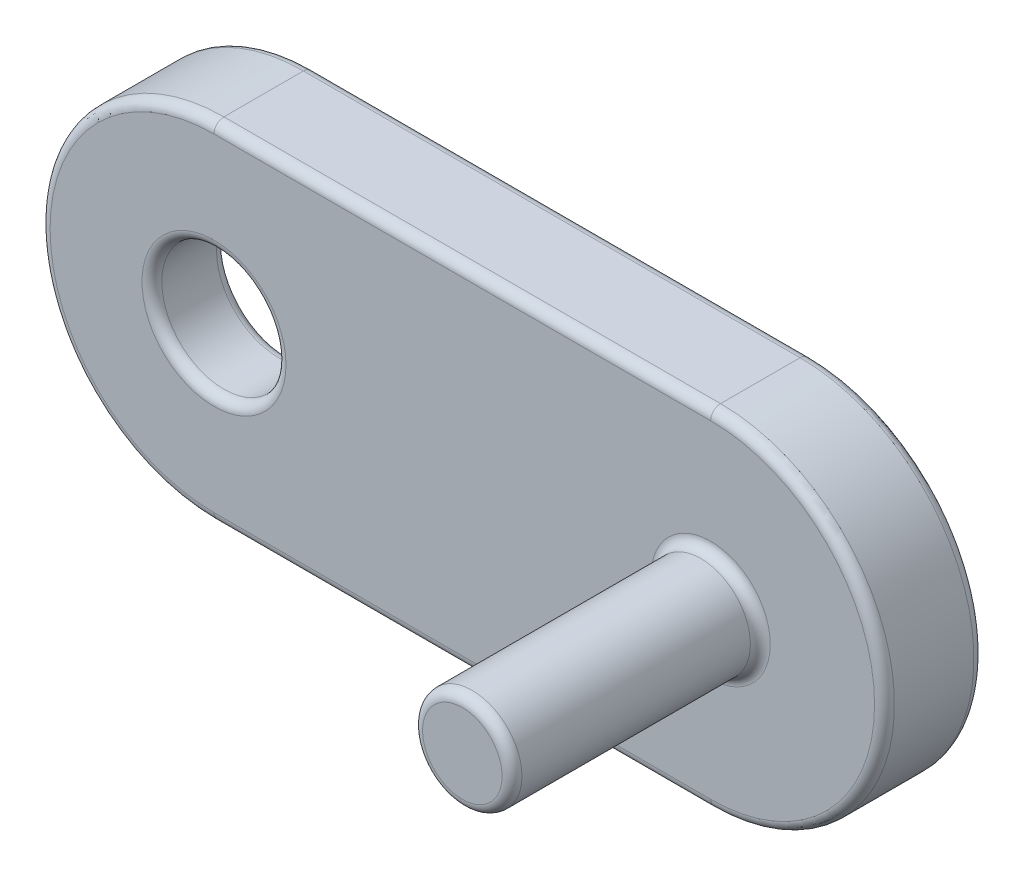
ISO-10303-21;
HEADER;
FILE_DESCRIPTION(('STEP AP214'),'2;1');
FILE_NAME('part.step','',(''),(''),'','','');
FILE_SCHEMA(('AUTOMOTIVE_DESIGN { 1 0 10303 214 1 1 1 1 }'));
ENDSEC;
DATA;
#1=APPLICATION_CONTEXT('core data for automotive mechanical design processes');
#2=APPLICATION_PROTOCOL_DEFINITION('international standard','automotive_design',2000,#1);
#3=PRODUCT_CONTEXT('',#1,'mechanical');
#4=PRODUCT('Part','Part','',(#3));
#5=PRODUCT_RELATED_PRODUCT_CATEGORY('part','',(#4));
#6=PRODUCT_DEFINITION_FORMATION('','',#4);
#7=PRODUCT_DEFINITION_CONTEXT('part definition',#1,'design');
#8=PRODUCT_DEFINITION('design','',#6,#7);
#9=PRODUCT_DEFINITION_SHAPE('','',#8);
#10=(LENGTH_UNIT() NAMED_UNIT(*) SI_UNIT(.MILLI.,.METRE.));
#11=(NAMED_UNIT(*) PLANE_ANGLE_UNIT() SI_UNIT($,.RADIAN.));
#12=(NAMED_UNIT(*) SI_UNIT($,.STERADIAN.) SOLID_ANGLE_UNIT());
#13=UNCERTAINTY_MEASURE_WITH_UNIT(LENGTH_MEASURE(1.E-05),#10,'distance_accuracy_value','');
#14=(GEOMETRIC_REPRESENTATION_CONTEXT(3) GLOBAL_UNCERTAINTY_ASSIGNED_CONTEXT((#13)) GLOBAL_UNIT_ASSIGNED_CONTEXT((#10,
#11,#12)) REPRESENTATION_CONTEXT('',''));
#15=CARTESIAN_POINT('',(0.,0.,0.));
#16=DIRECTION('',(0.,0.,1.));
#17=DIRECTION('',(1.,0.,0.));
#18=AXIS2_PLACEMENT_3D('',#15,#16,#17);
#19=CARTESIAN_POINT('',(-5.,0.,2.));
#20=DIRECTION('',(0.,0.,1.));
#21=DIRECTION('',(1.,0.,0.));
#22=AXIS2_PLACEMENT_3D('',#19,#20,#21);
#23=PLANE('',#22);
#24=CARTESIAN_POINT('',(-5.,0.,2.));
#25=DIRECTION('',(0.,0.,1.));
#26=DIRECTION('',(1.,0.,0.));
#27=AXIS2_PLACEMENT_3D('',#24,#25,#26);
#28=CIRCLE('',#27,1.45);
#29=CARTESIAN_POINT('',(-3.55,0.,2.));
#30=VERTEX_POINT('',#29);
#31=EDGE_CURVE('E245',#30,#30,#28,.F.);
#32=ORIENTED_EDGE('',*,*,#31,.T.);
#33=EDGE_LOOP('',(#32));
#34=FACE_BOUND('',#33,.T.);
#35=CARTESIAN_POINT('',(5.,0.,2.));
#36=DIRECTION('',(0.,0.,1.));
#37=DIRECTION('',(1.,0.,0.));
#38=AXIS2_PLACEMENT_3D('',#35,#36,#37);
#39=CIRCLE('',#38,3.3);
#40=CARTESIAN_POINT('',(5.,-3.3,2.));
#41=VERTEX_POINT('',#40);
#42=CARTESIAN_POINT('',(5.,3.3,2.));
#43=VERTEX_POINT('',#42);
#44=EDGE_CURVE('E48',#41,#43,#39,.T.);
#45=ORIENTED_EDGE('',*,*,#44,.T.);
#46=DIRECTION('',(-1.,0.,0.));
#47=VECTOR('',#46,1.);
#48=CARTESIAN_POINT('',(-5.,3.3,2.));
#49=LINE('',#48,#47);
#50=CARTESIAN_POINT('',(-5.,3.3,2.));
#51=VERTEX_POINT('',#50);
#52=EDGE_CURVE('E243',#43,#51,#49,.T.);
#53=ORIENTED_EDGE('',*,*,#52,.T.);
#54=CARTESIAN_POINT('',(-5.,0.,2.));
#55=DIRECTION('',(0.,0.,1.));
#56=DIRECTION('',(1.,0.,0.));
#57=AXIS2_PLACEMENT_3D('',#54,#55,#56);
#58=CIRCLE('',#57,3.3);
#59=CARTESIAN_POINT('',(-5.,-3.3,2.));
#60=VERTEX_POINT('',#59);
#61=EDGE_CURVE('E239',#51,#60,#58,.T.);
#62=ORIENTED_EDGE('',*,*,#61,.T.);
#63=DIRECTION('',(1.,0.,0.));
#64=VECTOR('',#63,1.);
#65=CARTESIAN_POINT('',(5.,-3.3,2.));
#66=LINE('',#65,#64);
#67=EDGE_CURVE('E53',#60,#41,#66,.T.);
#68=ORIENTED_EDGE('',*,*,#67,.T.);
#69=EDGE_LOOP('',(#45,#53,#62,#68));
#70=FACE_BOUND('',#69,.T.);
#71=CARTESIAN_POINT('',(5.,0.,2.));
#72=DIRECTION('',(0.,0.,1.));
#73=DIRECTION('',(1.,0.,0.));
#74=AXIS2_PLACEMENT_3D('',#71,#72,#73);
#75=CIRCLE('',#74,1.2);
#76=CARTESIAN_POINT('',(6.2,0.,2.));
#77=VERTEX_POINT('',#76);
#78=EDGE_CURVE('E236',#77,#77,#75,.F.);
#79=ORIENTED_EDGE('',*,*,#78,.T.);
#80=EDGE_LOOP('',(#79));
#81=FACE_BOUND('',#80,.T.);
#82=ADVANCED_FACE('F33',(#34,#70,#81),#23,.T.);
#83=CARTESIAN_POINT('',(-5.,0.,2.));
#84=DIRECTION('',(0.,0.,-1.));
#85=DIRECTION('',(-1.,0.,0.));
#86=AXIS2_PLACEMENT_3D('',#83,#84,#85);
#87=CYLINDRICAL_SURFACE('',#86,3.5);
#88=DIRECTION('',(0.,0.,-1.));
#89=VECTOR('',#88,1.);
#90=CARTESIAN_POINT('',(-5.,3.5,2.));
#91=LINE('',#90,#89);
#92=CARTESIAN_POINT('',(-5.,3.5,1.8));
#93=VERTEX_POINT('',#92);
#94=CARTESIAN_POINT('',(-5.,3.5,0.2));
#95=VERTEX_POINT('',#94);
#96=EDGE_CURVE('E334',#93,#95,#91,.T.);
#97=ORIENTED_EDGE('',*,*,#96,.T.);
#98=CARTESIAN_POINT('',(-5.,0.,0.2));
#99=DIRECTION('',(0.,0.,1.));
#100=DIRECTION('',(1.,0.,0.));
#101=AXIS2_PLACEMENT_3D('',#98,#99,#100);
#102=CIRCLE('',#101,3.5);
#103=CARTESIAN_POINT('',(-5.,-3.5,0.2));
#104=VERTEX_POINT('',#103);
#105=EDGE_CURVE('E234',#95,#104,#102,.T.);
#106=ORIENTED_EDGE('',*,*,#105,.T.);
#107=DIRECTION('',(0.,0.,-1.));
#108=VECTOR('',#107,1.);
#109=CARTESIAN_POINT('',(-5.,-3.5,2.));
#110=LINE('',#109,#108);
#111=CARTESIAN_POINT('',(-5.,-3.5,1.8));
#112=VERTEX_POINT('',#111);
#113=EDGE_CURVE('E297',#112,#104,#110,.T.);
#114=ORIENTED_EDGE('',*,*,#113,.F.);
#115=CARTESIAN_POINT('',(-5.,0.,1.8));
#116=DIRECTION('',(0.,0.,1.));
#117=DIRECTION('',(1.,0.,0.));
#118=AXIS2_PLACEMENT_3D('',#115,#116,#117);
#119=CIRCLE('',#118,3.5);
#120=EDGE_CURVE('E232',#112,#93,#119,.F.);
#121=ORIENTED_EDGE('',*,*,#120,.T.);
#122=EDGE_LOOP('',(#97,#106,#114,#121));
#123=FACE_BOUND('',#122,.T.);
#124=ADVANCED_FACE('F35',(#123),#87,.T.);
#125=CARTESIAN_POINT('',(-5.,-3.5,2.));
#126=DIRECTION('',(0.,1.,0.));
#127=DIRECTION('',(0.,0.,1.));
#128=AXIS2_PLACEMENT_3D('',#125,#126,#127);
#129=PLANE('',#128);
#130=ORIENTED_EDGE('',*,*,#113,.T.);
#131=DIRECTION('',(1.,0.,0.));
#132=VECTOR('',#131,1.);
#133=CARTESIAN_POINT('',(-5.,-3.5,0.2));
#134=LINE('',#133,#132);
#135=CARTESIAN_POINT('',(5.,-3.5,0.2));
#136=VERTEX_POINT('',#135);
#137=EDGE_CURVE('E202',#104,#136,#134,.T.);
#138=ORIENTED_EDGE('',*,*,#137,.T.);
#139=DIRECTION('',(0.,0.,-1.));
#140=VECTOR('',#139,1.);
#141=CARTESIAN_POINT('',(5.,-3.5,2.));
#142=LINE('',#141,#140);
#143=CARTESIAN_POINT('',(5.,-3.5,1.8));
#144=VERTEX_POINT('',#143);
#145=EDGE_CURVE('E304',#144,#136,#142,.T.);
#146=ORIENTED_EDGE('',*,*,#145,.F.);
#147=DIRECTION('',(1.,0.,0.));
#148=VECTOR('',#147,1.);
#149=CARTESIAN_POINT('',(-5.,-3.5,1.8));
#150=LINE('',#149,#148);
#151=EDGE_CURVE('E200',#144,#112,#150,.F.);
#152=ORIENTED_EDGE('',*,*,#151,.T.);
#153=EDGE_LOOP('',(#130,#138,#146,#152));
#154=FACE_BOUND('',#153,.T.);
#155=ADVANCED_FACE('F278',(#154),#129,.F.);
#156=CARTESIAN_POINT('',(5.,0.,2.));
#157=DIRECTION('',(0.,0.,-1.));
#158=DIRECTION('',(-1.,0.,0.));
#159=AXIS2_PLACEMENT_3D('',#156,#157,#158);
#160=CYLINDRICAL_SURFACE('',#159,3.5);
#161=ORIENTED_EDGE('',*,*,#145,.T.);
#162=CARTESIAN_POINT('',(5.,0.,0.2));
#163=DIRECTION('',(0.,0.,1.));
#164=DIRECTION('',(1.,0.,0.));
#165=AXIS2_PLACEMENT_3D('',#162,#163,#164);
#166=CIRCLE('',#165,3.5);
#167=CARTESIAN_POINT('',(5.,3.5,0.2));
#168=VERTEX_POINT('',#167);
#169=EDGE_CURVE('E225',#136,#168,#166,.T.);
#170=ORIENTED_EDGE('',*,*,#169,.T.);
#171=DIRECTION('',(0.,0.,-1.));
#172=VECTOR('',#171,1.);
#173=CARTESIAN_POINT('',(5.,3.5,2.));
#174=LINE('',#173,#172);
#175=CARTESIAN_POINT('',(5.,3.5,1.8));
#176=VERTEX_POINT('',#175);
#177=EDGE_CURVE('E329',#176,#168,#174,.T.);
#178=ORIENTED_EDGE('',*,*,#177,.F.);
#179=CARTESIAN_POINT('',(5.,0.,1.8));
#180=DIRECTION('',(0.,0.,1.));
#181=DIRECTION('',(1.,0.,0.));
#182=AXIS2_PLACEMENT_3D('',#179,#180,#181);
#183=CIRCLE('',#182,3.5);
#184=EDGE_CURVE('E223',#176,#144,#183,.F.);
#185=ORIENTED_EDGE('',*,*,#184,.T.);
#186=EDGE_LOOP('',(#161,#170,#178,#185));
#187=FACE_BOUND('',#186,.T.);
#188=ADVANCED_FACE('F287',(#187),#160,.T.);
#189=CARTESIAN_POINT('',(-5.,3.5,2.));
#190=DIRECTION('',(0.,-1.,0.));
#191=DIRECTION('',(0.,0.,-1.));
#192=AXIS2_PLACEMENT_3D('',#189,#190,#191);
#193=PLANE('',#192);
#194=ORIENTED_EDGE('',*,*,#177,.T.);
#195=DIRECTION('',(-1.,0.,0.));
#196=VECTOR('',#195,1.);
#197=CARTESIAN_POINT('',(-5.,3.5,0.2));
#198=LINE('',#197,#196);
#199=EDGE_CURVE('E230',#168,#95,#198,.T.);
#200=ORIENTED_EDGE('',*,*,#199,.T.);
#201=ORIENTED_EDGE('',*,*,#96,.F.);
#202=DIRECTION('',(-1.,0.,0.));
#203=VECTOR('',#202,1.);
#204=CARTESIAN_POINT('',(5.,3.5,1.8));
#205=LINE('',#204,#203);
#206=EDGE_CURVE('E227',#93,#176,#205,.F.);
#207=ORIENTED_EDGE('',*,*,#206,.T.);
#208=EDGE_LOOP('',(#194,#200,#201,#207));
#209=FACE_BOUND('',#208,.T.);
#210=ADVANCED_FACE('F284',(#209),#193,.F.);
#211=CARTESIAN_POINT('',(-5.,0.,0.));
#212=DIRECTION('',(0.,0.,1.));
#213=DIRECTION('',(1.,0.,0.));
#214=AXIS2_PLACEMENT_3D('',#211,#212,#213);
#215=PLANE('',#214);
#216=CARTESIAN_POINT('',(5.,0.,0.));
#217=DIRECTION('',(0.,0.,1.));
#218=DIRECTION('',(1.,0.,0.));
#219=AXIS2_PLACEMENT_3D('',#216,#217,#218);
#220=CIRCLE('',#219,3.3);
#221=CARTESIAN_POINT('',(5.,3.3,0.));
#222=VERTEX_POINT('',#221);
#223=CARTESIAN_POINT('',(5.,-3.3,0.));
#224=VERTEX_POINT('',#223);
#225=EDGE_CURVE('E218',#222,#224,#220,.F.);
#226=ORIENTED_EDGE('',*,*,#225,.T.);
#227=DIRECTION('',(1.,0.,0.));
#228=VECTOR('',#227,1.);
#229=CARTESIAN_POINT('',(-5.,-3.3,0.));
#230=LINE('',#229,#228);
#231=CARTESIAN_POINT('',(-5.,-3.3,0.));
#232=VERTEX_POINT('',#231);
#233=EDGE_CURVE('E220',#224,#232,#230,.F.);
#234=ORIENTED_EDGE('',*,*,#233,.T.);
#235=CARTESIAN_POINT('',(-5.,0.,0.));
#236=DIRECTION('',(0.,0.,1.));
#237=DIRECTION('',(1.,0.,0.));
#238=AXIS2_PLACEMENT_3D('',#235,#236,#237);
#239=CIRCLE('',#238,3.3);
#240=CARTESIAN_POINT('',(-5.,3.3,0.));
#241=VERTEX_POINT('',#240);
#242=EDGE_CURVE('E214',#232,#241,#239,.F.);
#243=ORIENTED_EDGE('',*,*,#242,.T.);
#244=DIRECTION('',(-1.,0.,0.));
#245=VECTOR('',#244,1.);
#246=CARTESIAN_POINT('',(-5.,3.3,0.));
#247=LINE('',#246,#245);
#248=EDGE_CURVE('E216',#241,#222,#247,.F.);
#249=ORIENTED_EDGE('',*,*,#248,.T.);
#250=EDGE_LOOP('',(#226,#234,#243,#249));
#251=FACE_BOUND('',#250,.T.);
#252=DIRECTION('',(-1.,0.,0.));
#253=VECTOR('',#252,1.);
#254=CARTESIAN_POINT('',(-5.,-3.2,0.));
#255=LINE('',#254,#253);
#256=CARTESIAN_POINT('',(-5.,-3.2,0.));
#257=VERTEX_POINT('',#256);
#258=CARTESIAN_POINT('',(5.,-3.2,0.));
#259=VERTEX_POINT('',#258);
#260=EDGE_CURVE('E209',#257,#259,#255,.F.);
#261=ORIENTED_EDGE('',*,*,#260,.T.);
#262=CARTESIAN_POINT('',(5.,0.,0.));
#263=DIRECTION('',(0.,0.,1.));
#264=DIRECTION('',(1.,0.,0.));
#265=AXIS2_PLACEMENT_3D('',#262,#263,#264);
#266=CIRCLE('',#265,3.2);
#267=CARTESIAN_POINT('',(5.,3.2,0.));
#268=VERTEX_POINT('',#267);
#269=EDGE_CURVE('E211',#259,#268,#266,.T.);
#270=ORIENTED_EDGE('',*,*,#269,.T.);
#271=DIRECTION('',(1.,0.,0.));
#272=VECTOR('',#271,1.);
#273=CARTESIAN_POINT('',(-5.,3.2,0.));
#274=LINE('',#273,#272);
#275=CARTESIAN_POINT('',(-5.,3.2,0.));
#276=VERTEX_POINT('',#275);
#277=EDGE_CURVE('E205',#268,#276,#274,.F.);
#278=ORIENTED_EDGE('',*,*,#277,.T.);
#279=CARTESIAN_POINT('',(-5.,0.,0.));
#280=DIRECTION('',(0.,0.,1.));
#281=DIRECTION('',(1.,0.,0.));
#282=AXIS2_PLACEMENT_3D('',#279,#280,#281);
#283=CIRCLE('',#282,3.2);
#284=EDGE_CURVE('E207',#276,#257,#283,.T.);
#285=ORIENTED_EDGE('',*,*,#284,.T.);
#286=EDGE_LOOP('',(#261,#270,#278,#285));
#287=FACE_BOUND('',#286,.T.);
#288=ADVANCED_FACE('F282',(#251,#287),#215,.F.);
#289=CARTESIAN_POINT('',(-5.,0.,0.5));
#290=DIRECTION('',(0.,0.,-1.));
#291=DIRECTION('',(-1.,0.,0.));
#292=AXIS2_PLACEMENT_3D('',#289,#290,#291);
#293=CYLINDRICAL_SURFACE('',#292,3.);
#294=DIRECTION('',(0.,0.,-1.));
#295=VECTOR('',#294,1.);
#296=CARTESIAN_POINT('',(-5.,3.,0.5));
#297=LINE('',#296,#295);
#298=CARTESIAN_POINT('',(-5.,3.,0.3));
#299=VERTEX_POINT('',#298);
#300=CARTESIAN_POINT('',(-5.,3.,0.2));
#301=VERTEX_POINT('',#300);
#302=EDGE_CURVE('E348',#299,#301,#297,.T.);
#303=ORIENTED_EDGE('',*,*,#302,.F.);
#304=CARTESIAN_POINT('',(-5.,0.,0.3));
#305=DIRECTION('',(0.,0.,-1.));
#306=DIRECTION('',(-1.,0.,0.));
#307=AXIS2_PLACEMENT_3D('',#304,#305,#306);
#308=CIRCLE('',#307,3.);
#309=CARTESIAN_POINT('',(-5.,-3.,0.3));
#310=VERTEX_POINT('',#309);
#311=EDGE_CURVE('E192',#299,#310,#308,.F.);
#312=ORIENTED_EDGE('',*,*,#311,.T.);
#313=DIRECTION('',(0.,0.,-1.));
#314=VECTOR('',#313,1.);
#315=CARTESIAN_POINT('',(-5.,-3.,0.5));
#316=LINE('',#315,#314);
#317=CARTESIAN_POINT('',(-5.,-3.,0.2));
#318=VERTEX_POINT('',#317);
#319=EDGE_CURVE('E349',#310,#318,#316,.T.);
#320=ORIENTED_EDGE('',*,*,#319,.T.);
#321=CARTESIAN_POINT('',(-5.,0.,0.2));
#322=DIRECTION('',(0.,0.,1.));
#323=DIRECTION('',(1.,0.,0.));
#324=AXIS2_PLACEMENT_3D('',#321,#322,#323);
#325=CIRCLE('',#324,3.);
#326=EDGE_CURVE('E190',#318,#301,#325,.F.);
#327=ORIENTED_EDGE('',*,*,#326,.T.);
#328=EDGE_LOOP('',(#303,#312,#320,#327));
#329=FACE_BOUND('',#328,.T.);
#330=ADVANCED_FACE('F398',(#329),#293,.F.);
#331=CARTESIAN_POINT('',(5.,-3.,0.5));
#332=DIRECTION('',(0.,-1.,0.));
#333=DIRECTION('',(1.,0.,0.));
#334=AXIS2_PLACEMENT_3D('',#331,#332,#333);
#335=PLANE('',#334);
#336=ORIENTED_EDGE('',*,*,#319,.F.);
#337=DIRECTION('',(-1.,0.,0.));
#338=VECTOR('',#337,1.);
#339=CARTESIAN_POINT('',(5.,-3.,0.3));
#340=LINE('',#339,#338);
#341=CARTESIAN_POINT('',(5.,-3.,0.3));
#342=VERTEX_POINT('',#341);
#343=EDGE_CURVE('E153',#310,#342,#340,.F.);
#344=ORIENTED_EDGE('',*,*,#343,.T.);
#345=DIRECTION('',(0.,0.,-1.));
#346=VECTOR('',#345,1.);
#347=CARTESIAN_POINT('',(5.,-3.,0.5));
#348=LINE('',#347,#346);
#349=CARTESIAN_POINT('',(5.,-3.,0.2));
#350=VERTEX_POINT('',#349);
#351=EDGE_CURVE('E352',#342,#350,#348,.T.);
#352=ORIENTED_EDGE('',*,*,#351,.T.);
#353=DIRECTION('',(-1.,0.,0.));
#354=VECTOR('',#353,1.);
#355=CARTESIAN_POINT('',(5.,-3.,0.2));
#356=LINE('',#355,#354);
#357=EDGE_CURVE('E174',#350,#318,#356,.T.);
#358=ORIENTED_EDGE('',*,*,#357,.T.);
#359=EDGE_LOOP('',(#336,#344,#352,#358));
#360=FACE_BOUND('',#359,.T.);
#361=ADVANCED_FACE('F375',(#360),#335,.F.);
#362=CARTESIAN_POINT('',(5.,0.,0.5));
#363=DIRECTION('',(0.,0.,-1.));
#364=DIRECTION('',(-1.,0.,0.));
#365=AXIS2_PLACEMENT_3D('',#362,#363,#364);
#366=CYLINDRICAL_SURFACE('',#365,3.);
#367=ORIENTED_EDGE('',*,*,#351,.F.);
#368=CARTESIAN_POINT('',(5.,0.,0.3));
#369=DIRECTION('',(0.,0.,-1.));
#370=DIRECTION('',(-1.,0.,0.));
#371=AXIS2_PLACEMENT_3D('',#368,#369,#370);
#372=CIRCLE('',#371,3.);
#373=CARTESIAN_POINT('',(5.,3.,0.3));
#374=VERTEX_POINT('',#373);
#375=EDGE_CURVE('E184',#342,#374,#372,.F.);
#376=ORIENTED_EDGE('',*,*,#375,.T.);
#377=DIRECTION('',(0.,0.,-1.));
#378=VECTOR('',#377,1.);
#379=CARTESIAN_POINT('',(5.,3.,0.5));
#380=LINE('',#379,#378);
#381=CARTESIAN_POINT('',(5.,3.,0.2));
#382=VERTEX_POINT('',#381);
#383=EDGE_CURVE('E355',#374,#382,#380,.T.);
#384=ORIENTED_EDGE('',*,*,#383,.T.);
#385=CARTESIAN_POINT('',(5.,0.,0.2));
#386=DIRECTION('',(0.,0.,1.));
#387=DIRECTION('',(1.,0.,0.));
#388=AXIS2_PLACEMENT_3D('',#385,#386,#387);
#389=CIRCLE('',#388,3.);
#390=EDGE_CURVE('E181',#382,#350,#389,.F.);
#391=ORIENTED_EDGE('',*,*,#390,.T.);
#392=EDGE_LOOP('',(#367,#376,#384,#391));
#393=FACE_BOUND('',#392,.T.);
#394=ADVANCED_FACE('F376',(#393),#366,.F.);
#395=CARTESIAN_POINT('',(-5.,3.,0.5));
#396=DIRECTION('',(0.,1.,0.));
#397=DIRECTION('',(0.,0.,1.));
#398=AXIS2_PLACEMENT_3D('',#395,#396,#397);
#399=PLANE('',#398);
#400=ORIENTED_EDGE('',*,*,#383,.F.);
#401=DIRECTION('',(1.,0.,0.));
#402=VECTOR('',#401,1.);
#403=CARTESIAN_POINT('',(-5.,3.,0.3));
#404=LINE('',#403,#402);
#405=EDGE_CURVE('E188',#374,#299,#404,.F.);
#406=ORIENTED_EDGE('',*,*,#405,.T.);
#407=ORIENTED_EDGE('',*,*,#302,.T.);
#408=DIRECTION('',(1.,0.,0.));
#409=VECTOR('',#408,1.);
#410=CARTESIAN_POINT('',(-5.,3.,0.2));
#411=LINE('',#410,#409);
#412=EDGE_CURVE('E186',#301,#382,#411,.T.);
#413=ORIENTED_EDGE('',*,*,#412,.T.);
#414=EDGE_LOOP('',(#400,#406,#407,#413));
#415=FACE_BOUND('',#414,.T.);
#416=ADVANCED_FACE('F409',(#415),#399,.F.);
#417=CARTESIAN_POINT('',(-5.,0.,0.5));
#418=DIRECTION('',(0.,0.,-1.));
#419=DIRECTION('',(-1.,0.,0.));
#420=AXIS2_PLACEMENT_3D('',#417,#418,#419);
#421=PLANE('',#420);
#422=CARTESIAN_POINT('',(5.,0.,0.5));
#423=DIRECTION('',(0.,0.,-1.));
#424=DIRECTION('',(-1.,0.,0.));
#425=AXIS2_PLACEMENT_3D('',#422,#423,#424);
#426=CIRCLE('',#425,2.8);
#427=CARTESIAN_POINT('',(5.,2.8,0.5));
#428=VERTEX_POINT('',#427);
#429=CARTESIAN_POINT('',(5.,-2.8,0.5));
#430=VERTEX_POINT('',#429);
#431=EDGE_CURVE('E172',#428,#430,#426,.T.);
#432=ORIENTED_EDGE('',*,*,#431,.T.);
#433=DIRECTION('',(-1.,0.,0.));
#434=VECTOR('',#433,1.);
#435=CARTESIAN_POINT('',(-5.,-2.8,0.5));
#436=LINE('',#435,#434);
#437=CARTESIAN_POINT('',(-5.,-2.8,0.5));
#438=VERTEX_POINT('',#437);
#439=EDGE_CURVE('E151',#430,#438,#436,.T.);
#440=ORIENTED_EDGE('',*,*,#439,.T.);
#441=CARTESIAN_POINT('',(-5.,0.,0.5));
#442=DIRECTION('',(0.,0.,-1.));
#443=DIRECTION('',(-1.,0.,0.));
#444=AXIS2_PLACEMENT_3D('',#441,#442,#443);
#445=CIRCLE('',#444,2.8);
#446=CARTESIAN_POINT('',(-5.,2.8,0.5));
#447=VERTEX_POINT('',#446);
#448=EDGE_CURVE('E160',#438,#447,#445,.T.);
#449=ORIENTED_EDGE('',*,*,#448,.T.);
#450=DIRECTION('',(1.,0.,0.));
#451=VECTOR('',#450,1.);
#452=CARTESIAN_POINT('',(-5.,2.8,0.5));
#453=LINE('',#452,#451);
#454=EDGE_CURVE('E166',#447,#428,#453,.T.);
#455=ORIENTED_EDGE('',*,*,#454,.T.);
#456=EDGE_LOOP('',(#432,#440,#449,#455));
#457=FACE_BOUND('',#456,.T.);
#458=CARTESIAN_POINT('',(-5.,0.,0.5));
#459=DIRECTION('',(0.,0.,-1.));
#460=DIRECTION('',(-1.,0.,0.));
#461=AXIS2_PLACEMENT_3D('',#458,#459,#460);
#462=CIRCLE('',#461,1.45);
#463=CARTESIAN_POINT('',(-6.45,0.,0.5));
#464=VERTEX_POINT('',#463);
#465=EDGE_CURVE('E167',#464,#464,#462,.F.);
#466=ORIENTED_EDGE('',*,*,#465,.T.);
#467=EDGE_LOOP('',(#466));
#468=FACE_BOUND('',#467,.T.);
#469=ADVANCED_FACE('F169',(#457,#468),#421,.T.);
#470=CARTESIAN_POINT('',(-5.,0.,2.));
#471=DIRECTION('',(0.,0.,-1.));
#472=DIRECTION('',(-1.,0.,0.));
#473=AXIS2_PLACEMENT_3D('',#470,#471,#472);
#474=CYLINDRICAL_SURFACE('',#473,1.25);
#475=CARTESIAN_POINT('',(-5.,0.,0.7));
#476=DIRECTION('',(0.,0.,-1.));
#477=DIRECTION('',(-1.,0.,0.));
#478=AXIS2_PLACEMENT_3D('',#475,#476,#477);
#479=CIRCLE('',#478,1.25);
#480=CARTESIAN_POINT('',(-6.25,0.,0.7));
#481=VERTEX_POINT('',#480);
#482=EDGE_CURVE('E197',#481,#481,#479,.T.);
#483=ORIENTED_EDGE('',*,*,#482,.T.);
#484=EDGE_LOOP('',(#483));
#485=FACE_BOUND('',#484,.T.);
#486=CARTESIAN_POINT('',(-5.,0.,1.8));
#487=DIRECTION('',(0.,0.,1.));
#488=DIRECTION('',(1.,0.,0.));
#489=AXIS2_PLACEMENT_3D('',#486,#487,#488);
#490=CIRCLE('',#489,1.25);
#491=CARTESIAN_POINT('',(-3.75,0.,1.8));
#492=VERTEX_POINT('',#491);
#493=EDGE_CURVE('E194',#492,#492,#490,.T.);
#494=ORIENTED_EDGE('',*,*,#493,.T.);
#495=EDGE_LOOP('',(#494));
#496=FACE_BOUND('',#495,.T.);
#497=ADVANCED_FACE('F416',(#485,#496),#474,.F.);
#498=CARTESIAN_POINT('',(5.,0.,7.));
#499=DIRECTION('',(0.,0.,-1.));
#500=DIRECTION('',(-1.,0.,0.));
#501=AXIS2_PLACEMENT_3D('',#498,#499,#500);
#502=CYLINDRICAL_SURFACE('',#501,1.);
#503=CARTESIAN_POINT('',(5.,0.,2.2));
#504=DIRECTION('',(0.,0.,1.));
#505=DIRECTION('',(1.,0.,0.));
#506=AXIS2_PLACEMENT_3D('',#503,#504,#505);
#507=CIRCLE('',#506,1.);
#508=CARTESIAN_POINT('',(6.,0.,2.2));
#509=VERTEX_POINT('',#508);
#510=EDGE_CURVE('E41',#509,#509,#507,.T.);
#511=ORIENTED_EDGE('',*,*,#510,.T.);
#512=EDGE_LOOP('',(#511));
#513=FACE_BOUND('',#512,.T.);
#514=CARTESIAN_POINT('',(5.,0.,6.8));
#515=DIRECTION('',(0.,0.,1.));
#516=DIRECTION('',(1.,0.,0.));
#517=AXIS2_PLACEMENT_3D('',#514,#515,#516);
#518=CIRCLE('',#517,1.);
#519=CARTESIAN_POINT('',(6.,0.,6.8));
#520=VERTEX_POINT('',#519);
#521=EDGE_CURVE('E248',#520,#520,#518,.F.);
#522=ORIENTED_EDGE('',*,*,#521,.T.);
#523=EDGE_LOOP('',(#522));
#524=FACE_BOUND('',#523,.T.);
#525=ADVANCED_FACE('F253',(#513,#524),#502,.T.);
#526=CARTESIAN_POINT('',(5.,0.,7.));
#527=DIRECTION('',(0.,0.,1.));
#528=DIRECTION('',(1.,0.,0.));
#529=AXIS2_PLACEMENT_3D('',#526,#527,#528);
#530=PLANE('',#529);
#531=CARTESIAN_POINT('',(5.,0.,7.));
#532=DIRECTION('',(0.,0.,1.));
#533=DIRECTION('',(1.,0.,0.));
#534=AXIS2_PLACEMENT_3D('',#531,#532,#533);
#535=CIRCLE('',#534,0.8);
#536=CARTESIAN_POINT('',(5.8,0.,7.));
#537=VERTEX_POINT('',#536);
#538=EDGE_CURVE('E11',#537,#537,#535,.T.);
#539=ORIENTED_EDGE('',*,*,#538,.T.);
#540=EDGE_LOOP('',(#539));
#541=FACE_BOUND('',#540,.T.);
#542=ADVANCED_FACE('F466',(#541),#530,.T.);
#543=CARTESIAN_POINT('',(-5.,2.8,0.3));
#544=DIRECTION('',(1.,0.,0.));
#545=DIRECTION('',(0.,0.,-1.));
#546=AXIS2_PLACEMENT_3D('',#543,#544,#545);
#547=CYLINDRICAL_SURFACE('',#546,0.2);
#548=CARTESIAN_POINT('',(-5.,2.8,0.3));
#549=DIRECTION('',(1.,0.,0.));
#550=DIRECTION('',(0.,0.,-1.));
#551=AXIS2_PLACEMENT_3D('',#548,#549,#550);
#552=CIRCLE('',#551,0.2);
#553=EDGE_CURVE('E163',#299,#447,#552,.T.);
#554=ORIENTED_EDGE('',*,*,#553,.F.);
#555=ORIENTED_EDGE('',*,*,#405,.F.);
#556=CARTESIAN_POINT('',(5.,2.8,0.3));
#557=DIRECTION('',(-1.,0.,0.));
#558=DIRECTION('',(0.,-1.,0.));
#559=AXIS2_PLACEMENT_3D('',#556,#557,#558);
#560=CIRCLE('',#559,0.2);
#561=EDGE_CURVE('E345',#428,#374,#560,.T.);
#562=ORIENTED_EDGE('',*,*,#561,.F.);
#563=ORIENTED_EDGE('',*,*,#454,.F.);
#564=EDGE_LOOP('',(#554,#555,#562,#563));
#565=FACE_BOUND('',#564,.T.);
#566=ADVANCED_FACE('F366',(#565),#547,.F.);
#567=CARTESIAN_POINT('',(5.,0.,0.3));
#568=DIRECTION('',(0.,0.,-1.));
#569=DIRECTION('',(-1.,0.,0.));
#570=AXIS2_PLACEMENT_3D('',#567,#568,#569);
#571=TOROIDAL_SURFACE('',#570,2.8,0.2);
#572=ORIENTED_EDGE('',*,*,#561,.T.);
#573=ORIENTED_EDGE('',*,*,#375,.F.);
#574=CARTESIAN_POINT('',(5.,-2.8,0.3));
#575=DIRECTION('',(1.,0.,0.));
#576=DIRECTION('',(0.,0.,-1.));
#577=AXIS2_PLACEMENT_3D('',#574,#575,#576);
#578=CIRCLE('',#577,0.2);
#579=EDGE_CURVE('E156',#430,#342,#578,.T.);
#580=ORIENTED_EDGE('',*,*,#579,.F.);
#581=ORIENTED_EDGE('',*,*,#431,.F.);
#582=EDGE_LOOP('',(#572,#573,#580,#581));
#583=FACE_BOUND('',#582,.T.);
#584=ADVANCED_FACE('F369',(#583),#571,.F.);
#585=CARTESIAN_POINT('',(-5.,0.,0.3));
#586=DIRECTION('',(0.,0.,-1.));
#587=DIRECTION('',(-1.,0.,0.));
#588=AXIS2_PLACEMENT_3D('',#585,#586,#587);
#589=TOROIDAL_SURFACE('',#588,2.8,0.2);
#590=ORIENTED_EDGE('',*,*,#553,.T.);
#591=ORIENTED_EDGE('',*,*,#448,.F.);
#592=CARTESIAN_POINT('',(-5.,-2.8,0.3));
#593=DIRECTION('',(-1.,0.,0.));
#594=DIRECTION('',(0.,0.,1.));
#595=AXIS2_PLACEMENT_3D('',#592,#593,#594);
#596=CIRCLE('',#595,0.2);
#597=EDGE_CURVE('E147',#310,#438,#596,.T.);
#598=ORIENTED_EDGE('',*,*,#597,.F.);
#599=ORIENTED_EDGE('',*,*,#311,.F.);
#600=EDGE_LOOP('',(#590,#591,#598,#599));
#601=FACE_BOUND('',#600,.T.);
#602=ADVANCED_FACE('F161',(#601),#589,.F.);
#603=CARTESIAN_POINT('',(-5.,-2.8,0.3));
#604=DIRECTION('',(-1.,0.,0.));
#605=DIRECTION('',(0.,-1.,0.));
#606=AXIS2_PLACEMENT_3D('',#603,#604,#605);
#607=CYLINDRICAL_SURFACE('',#606,0.2);
#608=ORIENTED_EDGE('',*,*,#579,.T.);
#609=ORIENTED_EDGE('',*,*,#343,.F.);
#610=ORIENTED_EDGE('',*,*,#597,.T.);
#611=ORIENTED_EDGE('',*,*,#439,.F.);
#612=EDGE_LOOP('',(#608,#609,#610,#611));
#613=FACE_BOUND('',#612,.T.);
#614=ADVANCED_FACE('F149',(#613),#607,.F.);
#615=CARTESIAN_POINT('',(-5.,0.,0.7));
#616=DIRECTION('',(0.,0.,-1.));
#617=DIRECTION('',(-1.,0.,0.));
#618=AXIS2_PLACEMENT_3D('',#615,#616,#617);
#619=TOROIDAL_SURFACE('',#618,1.45,0.2);
#620=ORIENTED_EDGE('',*,*,#465,.F.);
#621=EDGE_LOOP('',(#620));
#622=FACE_BOUND('',#621,.T.);
#623=ORIENTED_EDGE('',*,*,#482,.F.);
#624=EDGE_LOOP('',(#623));
#625=FACE_BOUND('',#624,.T.);
#626=ADVANCED_FACE('F503',(#622,#625),#619,.T.);
#627=CARTESIAN_POINT('',(-5.,3.3,0.2));
#628=DIRECTION('',(-1.,0.,0.));
#629=DIRECTION('',(0.,0.,1.));
#630=AXIS2_PLACEMENT_3D('',#627,#628,#629);
#631=CYLINDRICAL_SURFACE('',#630,0.2);
#632=CARTESIAN_POINT('',(5.,3.3,0.2));
#633=DIRECTION('',(1.,0.,0.));
#634=DIRECTION('',(0.,0.,-1.));
#635=AXIS2_PLACEMENT_3D('',#632,#633,#634);
#636=CIRCLE('',#635,0.2);
#637=EDGE_CURVE('E314',#222,#168,#636,.T.);
#638=ORIENTED_EDGE('',*,*,#637,.F.);
#639=ORIENTED_EDGE('',*,*,#248,.F.);
#640=CARTESIAN_POINT('',(-5.,3.3,0.2));
#641=DIRECTION('',(-1.,0.,0.));
#642=DIRECTION('',(0.,0.,1.));
#643=AXIS2_PLACEMENT_3D('',#640,#641,#642);
#644=CIRCLE('',#643,0.2);
#645=EDGE_CURVE('E157',#95,#241,#644,.T.);
#646=ORIENTED_EDGE('',*,*,#645,.F.);
#647=ORIENTED_EDGE('',*,*,#199,.F.);
#648=EDGE_LOOP('',(#638,#639,#646,#647));
#649=FACE_BOUND('',#648,.T.);
#650=ADVANCED_FACE('F338',(#649),#631,.T.);
#651=CARTESIAN_POINT('',(-5.,0.,0.2));
#652=DIRECTION('',(0.,0.,1.));
#653=DIRECTION('',(1.,0.,0.));
#654=AXIS2_PLACEMENT_3D('',#651,#652,#653);
#655=TOROIDAL_SURFACE('',#654,3.3,0.2);
#656=ORIENTED_EDGE('',*,*,#645,.T.);
#657=ORIENTED_EDGE('',*,*,#242,.F.);
#658=CARTESIAN_POINT('',(-5.,-3.3,0.2));
#659=DIRECTION('',(1.,0.,0.));
#660=DIRECTION('',(0.,0.,-1.));
#661=AXIS2_PLACEMENT_3D('',#658,#659,#660);
#662=CIRCLE('',#661,0.2);
#663=EDGE_CURVE('E309',#104,#232,#662,.T.);
#664=ORIENTED_EDGE('',*,*,#663,.F.);
#665=ORIENTED_EDGE('',*,*,#105,.F.);
#666=EDGE_LOOP('',(#656,#657,#664,#665));
#667=FACE_BOUND('',#666,.T.);
#668=ADVANCED_FACE('F311',(#667),#655,.T.);
#669=CARTESIAN_POINT('',(5.,0.,0.2));
#670=DIRECTION('',(0.,0.,1.));
#671=DIRECTION('',(1.,0.,0.));
#672=AXIS2_PLACEMENT_3D('',#669,#670,#671);
#673=TOROIDAL_SURFACE('',#672,3.3,0.2);
#674=ORIENTED_EDGE('',*,*,#637,.T.);
#675=ORIENTED_EDGE('',*,*,#169,.F.);
#676=CARTESIAN_POINT('',(5.,-3.3,0.2));
#677=DIRECTION('',(-1.,0.,0.));
#678=DIRECTION('',(0.,0.,1.));
#679=AXIS2_PLACEMENT_3D('',#676,#677,#678);
#680=CIRCLE('',#679,0.2);
#681=EDGE_CURVE('E315',#224,#136,#680,.T.);
#682=ORIENTED_EDGE('',*,*,#681,.F.);
#683=ORIENTED_EDGE('',*,*,#225,.F.);
#684=EDGE_LOOP('',(#674,#675,#682,#683));
#685=FACE_BOUND('',#684,.T.);
#686=ADVANCED_FACE('F325',(#685),#673,.T.);
#687=CARTESIAN_POINT('',(-5.,-3.3,0.2));
#688=DIRECTION('',(1.,0.,0.));
#689=DIRECTION('',(0.,0.,-1.));
#690=AXIS2_PLACEMENT_3D('',#687,#688,#689);
#691=CYLINDRICAL_SURFACE('',#690,0.2);
#692=ORIENTED_EDGE('',*,*,#663,.T.);
#693=ORIENTED_EDGE('',*,*,#233,.F.);
#694=ORIENTED_EDGE('',*,*,#681,.T.);
#695=ORIENTED_EDGE('',*,*,#137,.F.);
#696=EDGE_LOOP('',(#692,#693,#694,#695));
#697=FACE_BOUND('',#696,.T.);
#698=ADVANCED_FACE('F317',(#697),#691,.T.);
#699=CARTESIAN_POINT('',(-5.,0.,0.2));
#700=DIRECTION('',(0.,0.,1.));
#701=DIRECTION('',(1.,0.,0.));
#702=AXIS2_PLACEMENT_3D('',#699,#700,#701);
#703=TOROIDAL_SURFACE('',#702,3.2,0.2);
#704=CARTESIAN_POINT('',(-5.,-3.2,0.2));
#705=DIRECTION('',(1.,0.,0.));
#706=DIRECTION('',(0.,0.,-1.));
#707=AXIS2_PLACEMENT_3D('',#704,#705,#706);
#708=CIRCLE('',#707,0.2);
#709=EDGE_CURVE('E394',#257,#318,#708,.T.);
#710=ORIENTED_EDGE('',*,*,#709,.F.);
#711=ORIENTED_EDGE('',*,*,#284,.F.);
#712=CARTESIAN_POINT('',(-5.,3.2,0.2));
#713=DIRECTION('',(1.,0.,0.));
#714=DIRECTION('',(0.,0.,-1.));
#715=AXIS2_PLACEMENT_3D('',#712,#713,#714);
#716=CIRCLE('',#715,0.2);
#717=EDGE_CURVE('E322',#301,#276,#716,.T.);
#718=ORIENTED_EDGE('',*,*,#717,.F.);
#719=ORIENTED_EDGE('',*,*,#326,.F.);
#720=EDGE_LOOP('',(#710,#711,#718,#719));
#721=FACE_BOUND('',#720,.T.);
#722=ADVANCED_FACE('F401',(#721),#703,.T.);
#723=CARTESIAN_POINT('',(-5.,3.2,0.2));
#724=DIRECTION('',(1.,0.,0.));
#725=DIRECTION('',(0.,0.,-1.));
#726=AXIS2_PLACEMENT_3D('',#723,#724,#725);
#727=CYLINDRICAL_SURFACE('',#726,0.2);
#728=ORIENTED_EDGE('',*,*,#717,.T.);
#729=ORIENTED_EDGE('',*,*,#277,.F.);
#730=CARTESIAN_POINT('',(5.,3.2,0.2));
#731=DIRECTION('',(1.,0.,0.));
#732=DIRECTION('',(0.,0.,-1.));
#733=AXIS2_PLACEMENT_3D('',#730,#731,#732);
#734=CIRCLE('',#733,0.2);
#735=EDGE_CURVE('E382',#382,#268,#734,.T.);
#736=ORIENTED_EDGE('',*,*,#735,.F.);
#737=ORIENTED_EDGE('',*,*,#412,.F.);
#738=EDGE_LOOP('',(#728,#729,#736,#737));
#739=FACE_BOUND('',#738,.T.);
#740=ADVANCED_FACE('F407',(#739),#727,.T.);
#741=CARTESIAN_POINT('',(5.,-3.2,0.2));
#742=DIRECTION('',(-1.,0.,0.));
#743=DIRECTION('',(0.,-1.,0.));
#744=AXIS2_PLACEMENT_3D('',#741,#742,#743);
#745=CYLINDRICAL_SURFACE('',#744,0.2);
#746=ORIENTED_EDGE('',*,*,#709,.T.);
#747=ORIENTED_EDGE('',*,*,#357,.F.);
#748=CARTESIAN_POINT('',(5.,-3.2,0.2));
#749=DIRECTION('',(1.,0.,0.));
#750=DIRECTION('',(0.,0.,-1.));
#751=AXIS2_PLACEMENT_3D('',#748,#749,#750);
#752=CIRCLE('',#751,0.2);
#753=EDGE_CURVE('E385',#259,#350,#752,.T.);
#754=ORIENTED_EDGE('',*,*,#753,.F.);
#755=ORIENTED_EDGE('',*,*,#260,.F.);
#756=EDGE_LOOP('',(#746,#747,#754,#755));
#757=FACE_BOUND('',#756,.T.);
#758=ADVANCED_FACE('F392',(#757),#745,.T.);
#759=CARTESIAN_POINT('',(5.,0.,0.2));
#760=DIRECTION('',(0.,0.,1.));
#761=DIRECTION('',(1.,0.,0.));
#762=AXIS2_PLACEMENT_3D('',#759,#760,#761);
#763=TOROIDAL_SURFACE('',#762,3.2,0.2);
#764=ORIENTED_EDGE('',*,*,#735,.T.);
#765=ORIENTED_EDGE('',*,*,#269,.F.);
#766=ORIENTED_EDGE('',*,*,#753,.T.);
#767=ORIENTED_EDGE('',*,*,#390,.F.);
#768=EDGE_LOOP('',(#764,#765,#766,#767));
#769=FACE_BOUND('',#768,.T.);
#770=ADVANCED_FACE('F380',(#769),#763,.T.);
#771=CARTESIAN_POINT('',(-5.,0.,1.8));
#772=DIRECTION('',(0.,0.,1.));
#773=DIRECTION('',(1.,0.,0.));
#774=AXIS2_PLACEMENT_3D('',#771,#772,#773);
#775=TOROIDAL_SURFACE('',#774,1.45,0.2);
#776=ORIENTED_EDGE('',*,*,#493,.F.);
#777=EDGE_LOOP('',(#776));
#778=FACE_BOUND('',#777,.T.);
#779=ORIENTED_EDGE('',*,*,#31,.F.);
#780=EDGE_LOOP('',(#779));
#781=FACE_BOUND('',#780,.T.);
#782=ADVANCED_FACE('F568',(#778,#781),#775,.T.);
#783=CARTESIAN_POINT('',(-5.,-3.3,1.8));
#784=DIRECTION('',(-1.,0.,0.));
#785=DIRECTION('',(0.,0.,1.));
#786=AXIS2_PLACEMENT_3D('',#783,#784,#785);
#787=CYLINDRICAL_SURFACE('',#786,0.2);
#788=CARTESIAN_POINT('',(-5.,-3.3,1.8));
#789=DIRECTION('',(-1.,0.,0.));
#790=DIRECTION('',(0.,0.,1.));
#791=AXIS2_PLACEMENT_3D('',#788,#789,#790);
#792=CIRCLE('',#791,0.2);
#793=EDGE_CURVE('E682',#112,#60,#792,.T.);
#794=ORIENTED_EDGE('',*,*,#793,.F.);
#795=ORIENTED_EDGE('',*,*,#151,.F.);
#796=CARTESIAN_POINT('',(5.,-3.3,1.8));
#797=DIRECTION('',(1.,0.,0.));
#798=DIRECTION('',(0.,0.,-1.));
#799=AXIS2_PLACEMENT_3D('',#796,#797,#798);
#800=CIRCLE('',#799,0.2);
#801=EDGE_CURVE('E389',#41,#144,#800,.T.);
#802=ORIENTED_EDGE('',*,*,#801,.F.);
#803=ORIENTED_EDGE('',*,*,#67,.F.);
#804=EDGE_LOOP('',(#794,#795,#802,#803));
#805=FACE_BOUND('',#804,.T.);
#806=ADVANCED_FACE('F576',(#805),#787,.T.);
#807=CARTESIAN_POINT('',(5.,0.,1.8));
#808=DIRECTION('',(0.,0.,1.));
#809=DIRECTION('',(1.,0.,0.));
#810=AXIS2_PLACEMENT_3D('',#807,#808,#809);
#811=TOROIDAL_SURFACE('',#810,3.3,0.2);
#812=ORIENTED_EDGE('',*,*,#801,.T.);
#813=ORIENTED_EDGE('',*,*,#184,.F.);
#814=CARTESIAN_POINT('',(5.,3.3,1.8));
#815=DIRECTION('',(-1.,0.,0.));
#816=DIRECTION('',(0.,0.,1.));
#817=AXIS2_PLACEMENT_3D('',#814,#815,#816);
#818=CIRCLE('',#817,0.2);
#819=EDGE_CURVE('E684',#43,#176,#818,.T.);
#820=ORIENTED_EDGE('',*,*,#819,.F.);
#821=ORIENTED_EDGE('',*,*,#44,.F.);
#822=EDGE_LOOP('',(#812,#813,#820,#821));
#823=FACE_BOUND('',#822,.T.);
#824=ADVANCED_FACE('F585',(#823),#811,.T.);
#825=CARTESIAN_POINT('',(-5.,0.,1.8));
#826=DIRECTION('',(0.,0.,1.));
#827=DIRECTION('',(1.,0.,0.));
#828=AXIS2_PLACEMENT_3D('',#825,#826,#827);
#829=TOROIDAL_SURFACE('',#828,3.3,0.2);
#830=ORIENTED_EDGE('',*,*,#793,.T.);
#831=ORIENTED_EDGE('',*,*,#61,.F.);
#832=CARTESIAN_POINT('',(-5.,3.3,1.8));
#833=DIRECTION('',(1.,0.,0.));
#834=DIRECTION('',(0.,0.,-1.));
#835=AXIS2_PLACEMENT_3D('',#832,#833,#834);
#836=CIRCLE('',#835,0.2);
#837=EDGE_CURVE('E688',#93,#51,#836,.T.);
#838=ORIENTED_EDGE('',*,*,#837,.F.);
#839=ORIENTED_EDGE('',*,*,#120,.F.);
#840=EDGE_LOOP('',(#830,#831,#838,#839));
#841=FACE_BOUND('',#840,.T.);
#842=ADVANCED_FACE('F268',(#841),#829,.T.);
#843=CARTESIAN_POINT('',(-5.,3.3,1.8));
#844=DIRECTION('',(1.,0.,0.));
#845=DIRECTION('',(0.,0.,-1.));
#846=AXIS2_PLACEMENT_3D('',#843,#844,#845);
#847=CYLINDRICAL_SURFACE('',#846,0.2);
#848=ORIENTED_EDGE('',*,*,#819,.T.);
#849=ORIENTED_EDGE('',*,*,#206,.F.);
#850=ORIENTED_EDGE('',*,*,#837,.T.);
#851=ORIENTED_EDGE('',*,*,#52,.F.);
#852=EDGE_LOOP('',(#848,#849,#850,#851));
#853=FACE_BOUND('',#852,.T.);
#854=ADVANCED_FACE('F259',(#853),#847,.T.);
#855=CARTESIAN_POINT('',(5.,0.,2.2));
#856=DIRECTION('',(0.,0.,1.));
#857=DIRECTION('',(1.,0.,0.));
#858=AXIS2_PLACEMENT_3D('',#855,#856,#857);
#859=TOROIDAL_SURFACE('',#858,1.2,0.2);
#860=ORIENTED_EDGE('',*,*,#78,.F.);
#861=EDGE_LOOP('',(#860));
#862=FACE_BOUND('',#861,.T.);
#863=ORIENTED_EDGE('',*,*,#510,.F.);
#864=EDGE_LOOP('',(#863));
#865=FACE_BOUND('',#864,.T.);
#866=ADVANCED_FACE('F256',(#862,#865),#859,.F.);
#867=CARTESIAN_POINT('',(5.,0.,6.8));
#868=DIRECTION('',(0.,0.,1.));
#869=DIRECTION('',(1.,0.,0.));
#870=AXIS2_PLACEMENT_3D('',#867,#868,#869);
#871=TOROIDAL_SURFACE('',#870,0.8,0.2);
#872=ORIENTED_EDGE('',*,*,#521,.F.);
#873=EDGE_LOOP('',(#872));
#874=FACE_BOUND('',#873,.T.);
#875=ORIENTED_EDGE('',*,*,#538,.F.);
#876=EDGE_LOOP('',(#875));
#877=FACE_BOUND('',#876,.T.);
#878=ADVANCED_FACE('F258',(#874,#877),#871,.T.);
#879=CLOSED_SHELL('',(#82,#124,#155,#188,#210,#288,#330,#361,#394,#416,#469,#497,#525,#542,#566,
#584,#602,#614,#626,#650,#668,#686,#698,#722,#740,#758,#770,#782,#806,#824,#842,#854,#866,#878));
#880=MANIFOLD_SOLID_BREP('B2',#879);
#881=ADVANCED_BREP_SHAPE_REPRESENTATION('',(#18,#880),#14);
#882=SHAPE_DEFINITION_REPRESENTATION(#9,#881);
ENDSEC;
END-ISO-10303-21;
